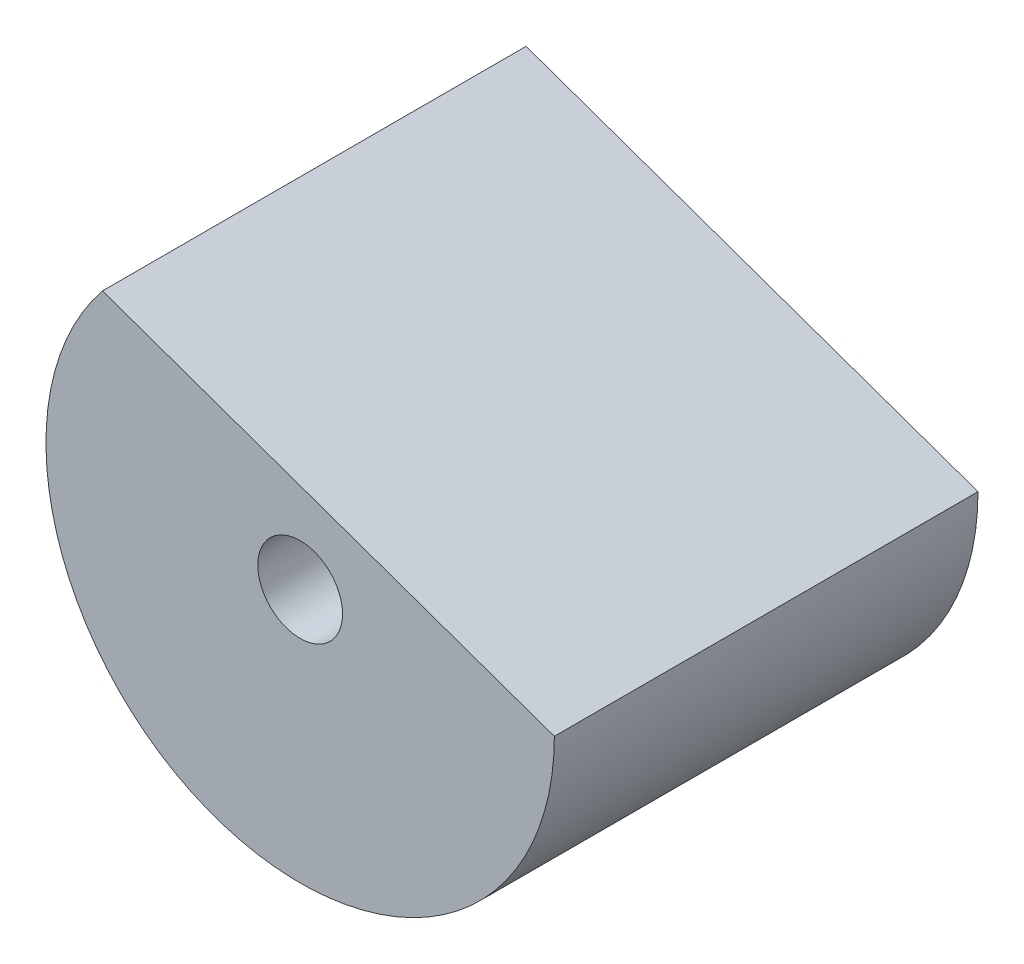
ISO-10303-21;
HEADER;
FILE_DESCRIPTION(('STEP AP214'),'2;1');
FILE_NAME('part.step','',(''),(''),'','','');
FILE_SCHEMA(('AUTOMOTIVE_DESIGN { 1 0 10303 214 1 1 1 1 }'));
ENDSEC;
DATA;
#1=APPLICATION_CONTEXT('core data for automotive mechanical design processes');
#2=APPLICATION_PROTOCOL_DEFINITION('international standard','automotive_design',2000,#1);
#3=PRODUCT_CONTEXT('',#1,'mechanical');
#4=PRODUCT('Part','Part','',(#3));
#5=PRODUCT_RELATED_PRODUCT_CATEGORY('part','',(#4));
#6=PRODUCT_DEFINITION_FORMATION('','',#4);
#7=PRODUCT_DEFINITION_CONTEXT('part definition',#1,'design');
#8=PRODUCT_DEFINITION('design','',#6,#7);
#9=PRODUCT_DEFINITION_SHAPE('','',#8);
#10=(LENGTH_UNIT() NAMED_UNIT(*) SI_UNIT(.MILLI.,.METRE.));
#11=(NAMED_UNIT(*) PLANE_ANGLE_UNIT() SI_UNIT($,.RADIAN.));
#12=(NAMED_UNIT(*) SI_UNIT($,.STERADIAN.) SOLID_ANGLE_UNIT());
#13=UNCERTAINTY_MEASURE_WITH_UNIT(LENGTH_MEASURE(1.E-05),#10,'distance_accuracy_value','');
#14=(GEOMETRIC_REPRESENTATION_CONTEXT(3) GLOBAL_UNCERTAINTY_ASSIGNED_CONTEXT((#13)) GLOBAL_UNIT_ASSIGNED_CONTEXT((#10,
#11,#12)) REPRESENTATION_CONTEXT('',''));
#15=CARTESIAN_POINT('',(0.,0.,0.));
#16=DIRECTION('',(0.,0.,1.));
#17=DIRECTION('',(1.,0.,0.));
#18=AXIS2_PLACEMENT_3D('',#15,#16,#17);
#19=CARTESIAN_POINT('',(0.,0.,5.));
#20=DIRECTION('',(0.,0.,1.));
#21=DIRECTION('',(1.,0.,0.));
#22=AXIS2_PLACEMENT_3D('',#19,#20,#21);
#23=PLANE('',#22);
#24=CARTESIAN_POINT('',(0.,0.,5.));
#25=DIRECTION('',(0.,0.,1.));
#26=DIRECTION('',(1.,0.,0.));
#27=AXIS2_PLACEMENT_3D('',#24,#25,#26);
#28=CIRCLE('',#27,3.);
#29=CARTESIAN_POINT('',(-2.33333333333333,1.88561808316413,5.));
#30=VERTEX_POINT('',#29);
#31=CARTESIAN_POINT('',(3.,0.,5.));
#32=VERTEX_POINT('',#31);
#33=EDGE_CURVE('E68',#30,#32,#28,.T.);
#34=ORIENTED_EDGE('',*,*,#33,.T.);
#35=DIRECTION('',(-0.942809041582063,0.333333333333333,0.));
#36=VECTOR('',#35,1.);
#37=CARTESIAN_POINT('',(3.,0.,5.));
#38=LINE('',#37,#36);
#39=EDGE_CURVE('E53',#32,#30,#38,.T.);
#40=ORIENTED_EDGE('',*,*,#39,.T.);
#41=EDGE_LOOP('',(#34,#40));
#42=FACE_BOUND('',#41,.T.);
#43=CARTESIAN_POINT('',(0.,0.,5.));
#44=DIRECTION('',(0.,0.,1.));
#45=DIRECTION('',(1.,0.,0.));
#46=AXIS2_PLACEMENT_3D('',#43,#44,#45);
#47=CIRCLE('',#46,0.5);
#48=CARTESIAN_POINT('',(0.5,0.,5.));
#49=VERTEX_POINT('',#48);
#50=EDGE_CURVE('E74',#49,#49,#47,.T.);
#51=ORIENTED_EDGE('',*,*,#50,.F.);
#52=EDGE_LOOP('',(#51));
#53=FACE_BOUND('',#52,.T.);
#54=ADVANCED_FACE('F37',(#42,#53),#23,.T.);
#55=CARTESIAN_POINT('',(0.,0.,0.));
#56=DIRECTION('',(0.,0.,1.));
#57=DIRECTION('',(1.,0.,0.));
#58=AXIS2_PLACEMENT_3D('',#55,#56,#57);
#59=PLANE('',#58);
#60=CARTESIAN_POINT('',(0.,0.,0.));
#61=DIRECTION('',(0.,0.,1.));
#62=DIRECTION('',(1.,0.,0.));
#63=AXIS2_PLACEMENT_3D('',#60,#61,#62);
#64=CIRCLE('',#63,3.);
#65=CARTESIAN_POINT('',(-2.33333333333333,1.88561808316413,0.));
#66=VERTEX_POINT('',#65);
#67=CARTESIAN_POINT('',(3.,0.,0.));
#68=VERTEX_POINT('',#67);
#69=EDGE_CURVE('E69',#66,#68,#64,.T.);
#70=ORIENTED_EDGE('',*,*,#69,.F.);
#71=DIRECTION('',(-0.942809041582063,0.333333333333333,0.));
#72=VECTOR('',#71,1.);
#73=CARTESIAN_POINT('',(3.,0.,0.));
#74=LINE('',#73,#72);
#75=EDGE_CURVE('E61',#68,#66,#74,.T.);
#76=ORIENTED_EDGE('',*,*,#75,.F.);
#77=EDGE_LOOP('',(#70,#76));
#78=FACE_BOUND('',#77,.T.);
#79=CARTESIAN_POINT('',(0.,0.,0.));
#80=DIRECTION('',(0.,0.,1.));
#81=DIRECTION('',(1.,0.,0.));
#82=AXIS2_PLACEMENT_3D('',#79,#80,#81);
#83=CIRCLE('',#82,0.5);
#84=CARTESIAN_POINT('',(0.5,0.,0.));
#85=VERTEX_POINT('',#84);
#86=EDGE_CURVE('E77',#85,#85,#83,.T.);
#87=ORIENTED_EDGE('',*,*,#86,.T.);
#88=EDGE_LOOP('',(#87));
#89=FACE_BOUND('',#88,.T.);
#90=ADVANCED_FACE('F72',(#78,#89),#59,.F.);
#91=CARTESIAN_POINT('',(0.,0.,5.));
#92=DIRECTION('',(0.,0.,-1.));
#93=DIRECTION('',(-1.,0.,0.));
#94=AXIS2_PLACEMENT_3D('',#91,#92,#93);
#95=CYLINDRICAL_SURFACE('',#94,3.);
#96=ORIENTED_EDGE('',*,*,#69,.T.);
#97=DIRECTION('',(0.,0.,-1.));
#98=VECTOR('',#97,1.);
#99=CARTESIAN_POINT('',(3.,0.,5.));
#100=LINE('',#99,#98);
#101=EDGE_CURVE('E11',#32,#68,#100,.T.);
#102=ORIENTED_EDGE('',*,*,#101,.F.);
#103=ORIENTED_EDGE('',*,*,#33,.F.);
#104=DIRECTION('',(0.,0.,-1.));
#105=VECTOR('',#104,1.);
#106=CARTESIAN_POINT('',(-2.33333333333333,1.88561808316413,5.));
#107=LINE('',#106,#105);
#108=EDGE_CURVE('E46',#30,#66,#107,.T.);
#109=ORIENTED_EDGE('',*,*,#108,.T.);
#110=EDGE_LOOP('',(#96,#102,#103,#109));
#111=FACE_BOUND('',#110,.T.);
#112=ADVANCED_FACE('F39',(#111),#95,.T.);
#113=CARTESIAN_POINT('',(3.,0.,5.));
#114=DIRECTION('',(-0.333333333333333,-0.942809041582063,0.));
#115=DIRECTION('',(0.942809041582063,-0.333333333333333,0.));
#116=AXIS2_PLACEMENT_3D('',#113,#114,#115);
#117=PLANE('',#116);
#118=ORIENTED_EDGE('',*,*,#75,.T.);
#119=ORIENTED_EDGE('',*,*,#108,.F.);
#120=ORIENTED_EDGE('',*,*,#39,.F.);
#121=ORIENTED_EDGE('',*,*,#101,.T.);
#122=EDGE_LOOP('',(#118,#119,#120,#121));
#123=FACE_BOUND('',#122,.T.);
#124=ADVANCED_FACE('F64',(#123),#117,.F.);
#125=CARTESIAN_POINT('',(0.,0.,5.));
#126=DIRECTION('',(0.,0.,-1.));
#127=DIRECTION('',(-1.,0.,0.));
#128=AXIS2_PLACEMENT_3D('',#125,#126,#127);
#129=CYLINDRICAL_SURFACE('',#128,0.5);
#130=ORIENTED_EDGE('',*,*,#50,.T.);
#131=EDGE_LOOP('',(#130));
#132=FACE_BOUND('',#131,.T.);
#133=ORIENTED_EDGE('',*,*,#86,.F.);
#134=EDGE_LOOP('',(#133));
#135=FACE_BOUND('',#134,.T.);
#136=ADVANCED_FACE('F85',(#132,#135),#129,.F.);
#137=CLOSED_SHELL('',(#54,#90,#112,#124,#136));
#138=MANIFOLD_SOLID_BREP('B2',#137);
#139=ADVANCED_BREP_SHAPE_REPRESENTATION('',(#18,#138),#14);
#140=SHAPE_DEFINITION_REPRESENTATION(#9,#139);
ENDSEC;
END-ISO-10303-21;
